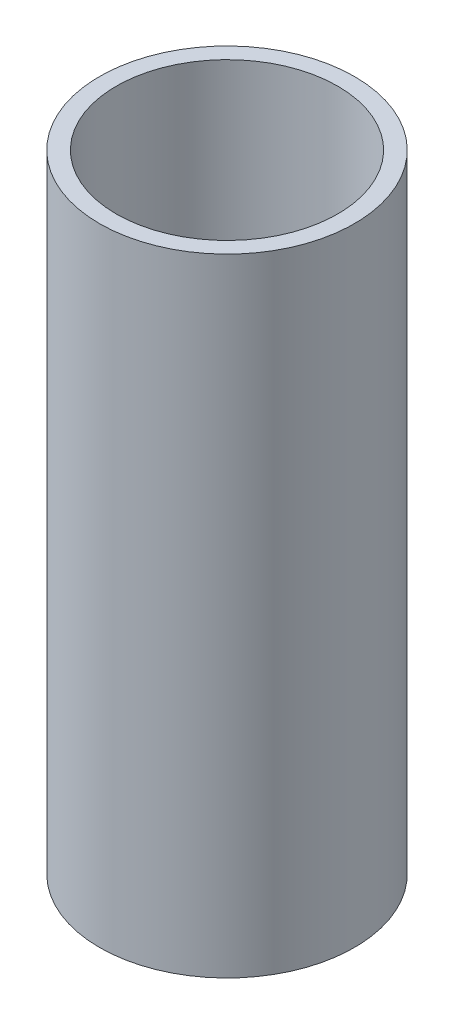
ISO-10303-21;
HEADER;
FILE_DESCRIPTION(('STEP AP214'),'2;1');
FILE_NAME('part.step','',(''),(''),'','','');
FILE_SCHEMA(('AUTOMOTIVE_DESIGN { 1 0 10303 214 1 1 1 1 }'));
ENDSEC;
DATA;
#1=APPLICATION_CONTEXT('core data for automotive mechanical design processes');
#2=APPLICATION_PROTOCOL_DEFINITION('international standard','automotive_design',2000,#1);
#3=PRODUCT_CONTEXT('',#1,'mechanical');
#4=PRODUCT('Part','Part','',(#3));
#5=PRODUCT_RELATED_PRODUCT_CATEGORY('part','',(#4));
#6=PRODUCT_DEFINITION_FORMATION('','',#4);
#7=PRODUCT_DEFINITION_CONTEXT('part definition',#1,'design');
#8=PRODUCT_DEFINITION('design','',#6,#7);
#9=PRODUCT_DEFINITION_SHAPE('','',#8);
#10=(LENGTH_UNIT() NAMED_UNIT(*) SI_UNIT(.MILLI.,.METRE.));
#11=(NAMED_UNIT(*) PLANE_ANGLE_UNIT() SI_UNIT($,.RADIAN.));
#12=(NAMED_UNIT(*) SI_UNIT($,.STERADIAN.) SOLID_ANGLE_UNIT());
#13=UNCERTAINTY_MEASURE_WITH_UNIT(LENGTH_MEASURE(1.E-05),#10,'distance_accuracy_value','');
#14=(GEOMETRIC_REPRESENTATION_CONTEXT(3) GLOBAL_UNCERTAINTY_ASSIGNED_CONTEXT((#13)) GLOBAL_UNIT_ASSIGNED_CONTEXT((#10,
#11,#12)) REPRESENTATION_CONTEXT('',''));
#15=CARTESIAN_POINT('',(0.,0.,0.));
#16=DIRECTION('',(0.,0.,1.));
#17=DIRECTION('',(1.,0.,0.));
#18=AXIS2_PLACEMENT_3D('',#15,#16,#17);
#19=CARTESIAN_POINT('',(0.,150.,0.));
#20=DIRECTION('',(0.,1.,0.));
#21=DIRECTION('',(0.,0.,1.));
#22=AXIS2_PLACEMENT_3D('',#19,#20,#21);
#23=PLANE('',#22);
#24=CARTESIAN_POINT('',(0.,150.,0.));
#25=DIRECTION('',(0.,1.,0.));
#26=DIRECTION('',(0.,0.,1.));
#27=AXIS2_PLACEMENT_3D('',#24,#25,#26);
#28=CIRCLE('',#27,30.5);
#29=CARTESIAN_POINT('',(0.,150.,30.5));
#30=VERTEX_POINT('',#29);
#31=EDGE_CURVE('E10',#30,#30,#28,.T.);
#32=ORIENTED_EDGE('',*,*,#31,.T.);
#33=EDGE_LOOP('',(#32));
#34=FACE_BOUND('',#33,.T.);
#35=CARTESIAN_POINT('',(0.,150.,0.));
#36=DIRECTION('',(0.,1.,0.));
#37=DIRECTION('',(0.,0.,1.));
#38=AXIS2_PLACEMENT_3D('',#35,#36,#37);
#39=CIRCLE('',#38,26.5);
#40=CARTESIAN_POINT('',(0.,150.,26.5));
#41=VERTEX_POINT('',#40);
#42=EDGE_CURVE('E42',#41,#41,#39,.T.);
#43=ORIENTED_EDGE('',*,*,#42,.F.);
#44=EDGE_LOOP('',(#43));
#45=FACE_BOUND('',#44,.T.);
#46=ADVANCED_FACE('F31',(#34,#45),#23,.T.);
#47=CARTESIAN_POINT('',(0.,0.,0.));
#48=DIRECTION('',(0.,1.,0.));
#49=DIRECTION('',(0.,0.,1.));
#50=AXIS2_PLACEMENT_3D('',#47,#48,#49);
#51=PLANE('',#50);
#52=CARTESIAN_POINT('',(0.,0.,0.));
#53=DIRECTION('',(0.,1.,0.));
#54=DIRECTION('',(0.,0.,1.));
#55=AXIS2_PLACEMENT_3D('',#52,#53,#54);
#56=CIRCLE('',#55,30.5);
#57=CARTESIAN_POINT('',(0.,0.,30.5));
#58=VERTEX_POINT('',#57);
#59=EDGE_CURVE('E35',#58,#58,#56,.T.);
#60=ORIENTED_EDGE('',*,*,#59,.F.);
#61=EDGE_LOOP('',(#60));
#62=FACE_BOUND('',#61,.T.);
#63=CARTESIAN_POINT('',(0.,0.,0.));
#64=DIRECTION('',(0.,1.,0.));
#65=DIRECTION('',(0.,0.,1.));
#66=AXIS2_PLACEMENT_3D('',#63,#64,#65);
#67=CIRCLE('',#66,26.5);
#68=CARTESIAN_POINT('',(0.,0.,26.5));
#69=VERTEX_POINT('',#68);
#70=EDGE_CURVE('E44',#69,#69,#67,.T.);
#71=ORIENTED_EDGE('',*,*,#70,.T.);
#72=EDGE_LOOP('',(#71));
#73=FACE_BOUND('',#72,.T.);
#74=ADVANCED_FACE('F54',(#62,#73),#51,.F.);
#75=CARTESIAN_POINT('',(0.,150.,0.));
#76=DIRECTION('',(0.,-1.,0.));
#77=DIRECTION('',(0.,0.,-1.));
#78=AXIS2_PLACEMENT_3D('',#75,#76,#77);
#79=CYLINDRICAL_SURFACE('',#78,30.5);
#80=ORIENTED_EDGE('',*,*,#31,.F.);
#81=EDGE_LOOP('',(#80));
#82=FACE_BOUND('',#81,.T.);
#83=ORIENTED_EDGE('',*,*,#59,.T.);
#84=EDGE_LOOP('',(#83));
#85=FACE_BOUND('',#84,.T.);
#86=ADVANCED_FACE('F33',(#82,#85),#79,.T.);
#87=CARTESIAN_POINT('',(0.,150.,0.));
#88=DIRECTION('',(0.,-1.,0.));
#89=DIRECTION('',(0.,0.,-1.));
#90=AXIS2_PLACEMENT_3D('',#87,#88,#89);
#91=CYLINDRICAL_SURFACE('',#90,26.5);
#92=ORIENTED_EDGE('',*,*,#42,.T.);
#93=EDGE_LOOP('',(#92));
#94=FACE_BOUND('',#93,.T.);
#95=ORIENTED_EDGE('',*,*,#70,.F.);
#96=EDGE_LOOP('',(#95));
#97=FACE_BOUND('',#96,.T.);
#98=ADVANCED_FACE('F50',(#94,#97),#91,.F.);
#99=CLOSED_SHELL('',(#46,#74,#86,#98));
#100=MANIFOLD_SOLID_BREP('B2',#99);
#101=ADVANCED_BREP_SHAPE_REPRESENTATION('',(#18,#100),#14);
#102=SHAPE_DEFINITION_REPRESENTATION(#9,#101);
ENDSEC;
END-ISO-10303-21;
